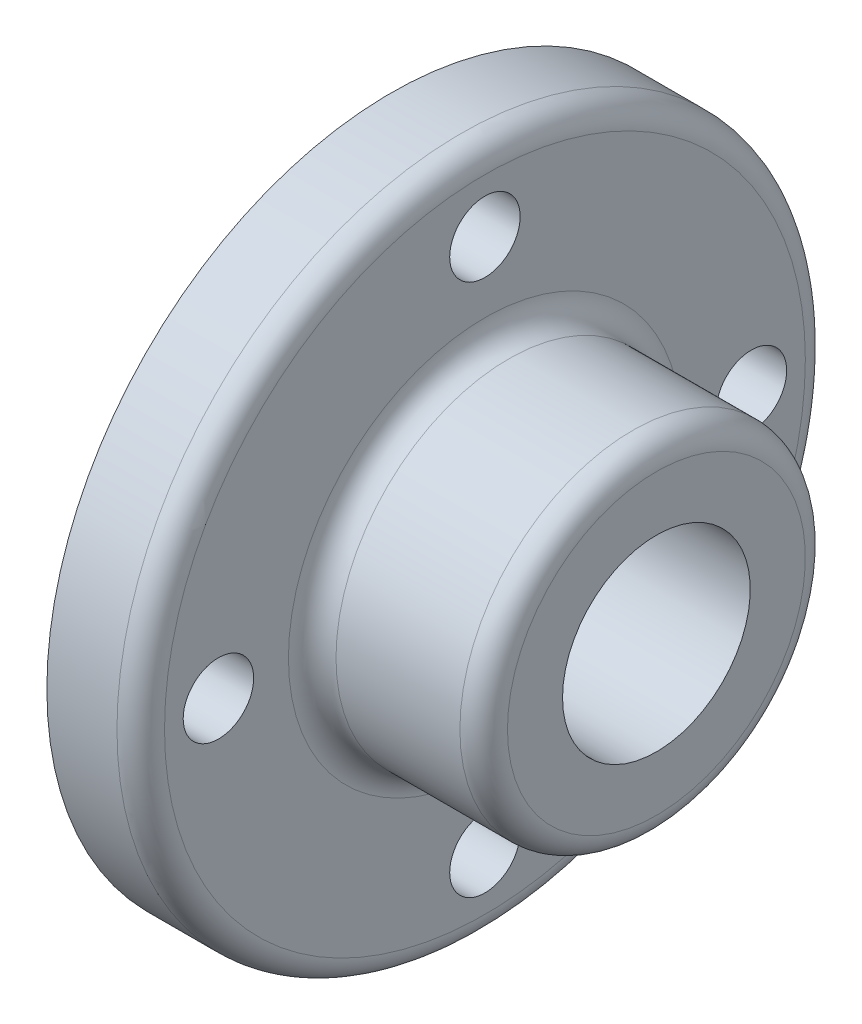
ISO-10303-21;
HEADER;
FILE_DESCRIPTION(('STEP AP214'),'2;1');
FILE_NAME('part.step','',(''),(''),'','','');
FILE_SCHEMA(('AUTOMOTIVE_DESIGN { 1 0 10303 214 1 1 1 1 }'));
ENDSEC;
DATA;
#1=APPLICATION_CONTEXT('core data for automotive mechanical design processes');
#2=APPLICATION_PROTOCOL_DEFINITION('international standard','automotive_design',2000,#1);
#3=PRODUCT_CONTEXT('',#1,'mechanical');
#4=PRODUCT('Part','Part','',(#3));
#5=PRODUCT_RELATED_PRODUCT_CATEGORY('part','',(#4));
#6=PRODUCT_DEFINITION_FORMATION('','',#4);
#7=PRODUCT_DEFINITION_CONTEXT('part definition',#1,'design');
#8=PRODUCT_DEFINITION('design','',#6,#7);
#9=PRODUCT_DEFINITION_SHAPE('','',#8);
#10=(LENGTH_UNIT() NAMED_UNIT(*) SI_UNIT(.MILLI.,.METRE.));
#11=(NAMED_UNIT(*) PLANE_ANGLE_UNIT() SI_UNIT($,.RADIAN.));
#12=(NAMED_UNIT(*) SI_UNIT($,.STERADIAN.) SOLID_ANGLE_UNIT());
#13=UNCERTAINTY_MEASURE_WITH_UNIT(LENGTH_MEASURE(1.E-05),#10,'distance_accuracy_value','');
#14=(GEOMETRIC_REPRESENTATION_CONTEXT(3) GLOBAL_UNCERTAINTY_ASSIGNED_CONTEXT((#13)) GLOBAL_UNIT_ASSIGNED_CONTEXT((#10,
#11,#12)) REPRESENTATION_CONTEXT('',''));
#15=CARTESIAN_POINT('',(0.,0.,0.));
#16=DIRECTION('',(0.,0.,1.));
#17=DIRECTION('',(1.,0.,0.));
#18=AXIS2_PLACEMENT_3D('',#15,#16,#17);
#19=CARTESIAN_POINT('',(-36.322,69.85,0.));
#20=DIRECTION('',(-1.,0.,0.));
#21=DIRECTION('',(0.,0.,1.));
#22=AXIS2_PLACEMENT_3D('',#19,#20,#21);
#23=PLANE('',#22);
#24=CARTESIAN_POINT('',(-36.322,0.,0.));
#25=DIRECTION('',(-1.,0.,0.));
#26=DIRECTION('',(0.,0.,1.));
#27=AXIS2_PLACEMENT_3D('',#24,#25,#26);
#28=CIRCLE('',#27,65.024);
#29=CARTESIAN_POINT('',(-36.322,0.,65.024));
#30=VERTEX_POINT('',#29);
#31=EDGE_CURVE('E60',#30,#30,#28,.F.);
#32=ORIENTED_EDGE('',*,*,#31,.T.);
#33=EDGE_LOOP('',(#32));
#34=FACE_BOUND('',#33,.T.);
#35=CARTESIAN_POINT('',(-36.322,0.,0.));
#36=DIRECTION('',(-1.,0.,0.));
#37=DIRECTION('',(0.,0.,1.));
#38=AXIS2_PLACEMENT_3D('',#35,#36,#37);
#39=CIRCLE('',#38,39.878);
#40=CARTESIAN_POINT('',(-36.322,0.,39.878));
#41=VERTEX_POINT('',#40);
#42=EDGE_CURVE('E65',#41,#41,#39,.T.);
#43=ORIENTED_EDGE('',*,*,#42,.T.);
#44=EDGE_LOOP('',(#43));
#45=FACE_BOUND('',#44,.T.);
#46=CARTESIAN_POINT('',(-36.322,-1.88828673336201E-13,-54.0826815356164));
#47=DIRECTION('',(-1.,0.,0.));
#48=DIRECTION('',(0.,0.,1.));
#49=AXIS2_PLACEMENT_3D('',#46,#47,#48);
#50=CIRCLE('',#49,7.1501);
#51=CARTESIAN_POINT('',(-36.322,-1.88828673336201E-13,-46.9325815356164));
#52=VERTEX_POINT('',#51);
#53=EDGE_CURVE('E86',#52,#52,#50,.T.);
#54=ORIENTED_EDGE('',*,*,#53,.T.);
#55=EDGE_LOOP('',(#54));
#56=FACE_BOUND('',#55,.T.);
#57=CARTESIAN_POINT('',(-36.322,-54.0826815356164,0.));
#58=DIRECTION('',(-1.,0.,0.));
#59=DIRECTION('',(0.,0.,1.));
#60=AXIS2_PLACEMENT_3D('',#57,#58,#59);
#61=CIRCLE('',#60,7.1501);
#62=CARTESIAN_POINT('',(-36.322,-54.0826815356164,7.1501));
#63=VERTEX_POINT('',#62);
#64=EDGE_CURVE('E89',#63,#63,#61,.T.);
#65=ORIENTED_EDGE('',*,*,#64,.T.);
#66=EDGE_LOOP('',(#65));
#67=FACE_BOUND('',#66,.T.);
#68=CARTESIAN_POINT('',(-36.322,5.66486020008603E-13,54.0826815356164));
#69=DIRECTION('',(-1.,0.,0.));
#70=DIRECTION('',(0.,0.,1.));
#71=AXIS2_PLACEMENT_3D('',#68,#69,#70);
#72=CIRCLE('',#71,7.1501);
#73=CARTESIAN_POINT('',(-36.322,5.66486020008603E-13,61.2327815356164));
#74=VERTEX_POINT('',#73);
#75=EDGE_CURVE('E92',#74,#74,#72,.T.);
#76=ORIENTED_EDGE('',*,*,#75,.T.);
#77=EDGE_LOOP('',(#76));
#78=FACE_BOUND('',#77,.T.);
#79=CARTESIAN_POINT('',(-36.322,54.0826815356164,0.));
#80=DIRECTION('',(-1.,0.,0.));
#81=DIRECTION('',(0.,0.,1.));
#82=AXIS2_PLACEMENT_3D('',#79,#80,#81);
#83=CIRCLE('',#82,7.1501);
#84=CARTESIAN_POINT('',(-36.322,54.0826815356164,7.1501));
#85=VERTEX_POINT('',#84);
#86=EDGE_CURVE('E78',#85,#85,#83,.T.);
#87=ORIENTED_EDGE('',*,*,#86,.T.);
#88=EDGE_LOOP('',(#87));
#89=FACE_BOUND('',#88,.T.);
#90=ADVANCED_FACE('F45',(#34,#45,#56,#67,#78,#89),#23,.F.);
#91=CARTESIAN_POINT('',(-88.7713924050633,0.,0.));
#92=DIRECTION('',(-1.,0.,0.));
#93=DIRECTION('',(0.,0.,1.));
#94=AXIS2_PLACEMENT_3D('',#91,#92,#93);
#95=CYLINDRICAL_SURFACE('',#94,69.85);
#96=CARTESIAN_POINT('',(-41.148,0.,0.));
#97=DIRECTION('',(-1.,0.,0.));
#98=DIRECTION('',(0.,0.,1.));
#99=AXIS2_PLACEMENT_3D('',#96,#97,#98);
#100=CIRCLE('',#99,69.85);
#101=CARTESIAN_POINT('',(-41.148,0.,69.85));
#102=VERTEX_POINT('',#101);
#103=EDGE_CURVE('E68',#102,#102,#100,.T.);
#104=ORIENTED_EDGE('',*,*,#103,.T.);
#105=EDGE_LOOP('',(#104));
#106=FACE_BOUND('',#105,.T.);
#107=CARTESIAN_POINT('',(-55.372,0.,0.));
#108=DIRECTION('',(-1.,0.,0.));
#109=DIRECTION('',(0.,0.,1.));
#110=AXIS2_PLACEMENT_3D('',#107,#108,#109);
#111=CIRCLE('',#110,69.85);
#112=CARTESIAN_POINT('',(-55.372,0.,69.85));
#113=VERTEX_POINT('',#112);
#114=EDGE_CURVE('E71',#113,#113,#111,.T.);
#115=ORIENTED_EDGE('',*,*,#114,.F.);
#116=EDGE_LOOP('',(#115));
#117=FACE_BOUND('',#116,.T.);
#118=ADVANCED_FACE('F112',(#106,#117),#95,.T.);
#119=CARTESIAN_POINT('',(-55.372,0.,0.));
#120=DIRECTION('',(1.,0.,0.));
#121=DIRECTION('',(0.,0.,-1.));
#122=AXIS2_PLACEMENT_3D('',#119,#120,#121);
#123=PLANE('',#122);
#124=CARTESIAN_POINT('',(-55.372,-1.88828673336201E-13,-54.0826815356164));
#125=DIRECTION('',(-1.,0.,0.));
#126=DIRECTION('',(0.,1.,0.));
#127=AXIS2_PLACEMENT_3D('',#124,#125,#126);
#128=CIRCLE('',#127,7.1501);
#129=CARTESIAN_POINT('',(-55.372,7.15009999999981,-54.0826815356165));
#130=VERTEX_POINT('',#129);
#131=EDGE_CURVE('E95',#130,#130,#128,.T.);
#132=ORIENTED_EDGE('',*,*,#131,.F.);
#133=EDGE_LOOP('',(#132));
#134=FACE_BOUND('',#133,.T.);
#135=CARTESIAN_POINT('',(-55.372,-54.0826815356164,0.));
#136=DIRECTION('',(-1.,0.,0.));
#137=DIRECTION('',(0.,0.,-1.));
#138=AXIS2_PLACEMENT_3D('',#135,#136,#137);
#139=CIRCLE('',#138,7.1501);
#140=CARTESIAN_POINT('',(-55.372,-54.0826815356164,-7.1501));
#141=VERTEX_POINT('',#140);
#142=EDGE_CURVE('E99',#141,#141,#139,.T.);
#143=ORIENTED_EDGE('',*,*,#142,.F.);
#144=EDGE_LOOP('',(#143));
#145=FACE_BOUND('',#144,.T.);
#146=CARTESIAN_POINT('',(-55.372,5.66486020008603E-13,54.0826815356164));
#147=DIRECTION('',(-1.,0.,0.));
#148=DIRECTION('',(0.,-1.,0.));
#149=AXIS2_PLACEMENT_3D('',#146,#147,#148);
#150=CIRCLE('',#149,7.1501);
#151=CARTESIAN_POINT('',(-55.372,-7.15009999999943,54.0826815356165));
#152=VERTEX_POINT('',#151);
#153=EDGE_CURVE('E96',#152,#152,#150,.T.);
#154=ORIENTED_EDGE('',*,*,#153,.F.);
#155=EDGE_LOOP('',(#154));
#156=FACE_BOUND('',#155,.T.);
#157=CARTESIAN_POINT('',(-55.372,54.0826815356164,0.));
#158=DIRECTION('',(-1.,0.,0.));
#159=DIRECTION('',(0.,0.,1.));
#160=AXIS2_PLACEMENT_3D('',#157,#158,#159);
#161=CIRCLE('',#160,7.1501);
#162=CARTESIAN_POINT('',(-55.372,54.0826815356164,7.1501));
#163=VERTEX_POINT('',#162);
#164=EDGE_CURVE('E83',#163,#163,#161,.T.);
#165=ORIENTED_EDGE('',*,*,#164,.F.);
#166=EDGE_LOOP('',(#165));
#167=FACE_BOUND('',#166,.T.);
#168=CARTESIAN_POINT('',(-55.372,0.,0.));
#169=DIRECTION('',(-1.,0.,0.));
#170=DIRECTION('',(0.,0.,1.));
#171=AXIS2_PLACEMENT_3D('',#168,#169,#170);
#172=CIRCLE('',#171,19.05);
#173=CARTESIAN_POINT('',(-55.372,0.,19.05));
#174=VERTEX_POINT('',#173);
#175=EDGE_CURVE('E75',#174,#174,#172,.T.);
#176=ORIENTED_EDGE('',*,*,#175,.F.);
#177=EDGE_LOOP('',(#176));
#178=FACE_BOUND('',#177,.T.);
#179=ORIENTED_EDGE('',*,*,#114,.T.);
#180=EDGE_LOOP('',(#179));
#181=FACE_BOUND('',#180,.T.);
#182=ADVANCED_FACE('F108',(#134,#145,#156,#167,#178,#181),#123,.F.);
#183=CARTESIAN_POINT('',(-1.52400000000001,35.052,0.));
#184=DIRECTION('',(-1.,0.,0.));
#185=DIRECTION('',(0.,0.,1.));
#186=AXIS2_PLACEMENT_3D('',#183,#184,#185);
#187=PLANE('',#186);
#188=CARTESIAN_POINT('',(-1.52400000000001,0.,0.));
#189=DIRECTION('',(-1.,0.,0.));
#190=DIRECTION('',(0.,0.,1.));
#191=AXIS2_PLACEMENT_3D('',#188,#189,#190);
#192=CIRCLE('',#191,30.226);
#193=CARTESIAN_POINT('',(-1.52400000000001,0.,30.226));
#194=VERTEX_POINT('',#193);
#195=EDGE_CURVE('E12',#194,#194,#192,.F.);
#196=ORIENTED_EDGE('',*,*,#195,.T.);
#197=EDGE_LOOP('',(#196));
#198=FACE_BOUND('',#197,.T.);
#199=CARTESIAN_POINT('',(-1.52400000000001,0.,0.));
#200=DIRECTION('',(-1.,0.,0.));
#201=DIRECTION('',(0.,0.,1.));
#202=AXIS2_PLACEMENT_3D('',#199,#200,#201);
#203=CIRCLE('',#202,19.05);
#204=CARTESIAN_POINT('',(-1.52400000000001,0.,19.05));
#205=VERTEX_POINT('',#204);
#206=EDGE_CURVE('E74',#205,#205,#203,.T.);
#207=ORIENTED_EDGE('',*,*,#206,.T.);
#208=EDGE_LOOP('',(#207));
#209=FACE_BOUND('',#208,.T.);
#210=ADVANCED_FACE('F111',(#198,#209),#187,.F.);
#211=CARTESIAN_POINT('',(-88.7713924050633,0.,0.));
#212=DIRECTION('',(-1.,0.,0.));
#213=DIRECTION('',(0.,0.,1.));
#214=AXIS2_PLACEMENT_3D('',#211,#212,#213);
#215=CYLINDRICAL_SURFACE('',#214,35.052);
#216=CARTESIAN_POINT('',(-31.496,0.,0.));
#217=DIRECTION('',(-1.,0.,0.));
#218=DIRECTION('',(0.,0.,1.));
#219=AXIS2_PLACEMENT_3D('',#216,#217,#218);
#220=CIRCLE('',#219,35.052);
#221=CARTESIAN_POINT('',(-31.496,0.,35.052));
#222=VERTEX_POINT('',#221);
#223=EDGE_CURVE('E52',#222,#222,#220,.F.);
#224=ORIENTED_EDGE('',*,*,#223,.T.);
#225=EDGE_LOOP('',(#224));
#226=FACE_BOUND('',#225,.T.);
#227=CARTESIAN_POINT('',(-6.35000000000001,0.,0.));
#228=DIRECTION('',(-1.,0.,0.));
#229=DIRECTION('',(0.,0.,1.));
#230=AXIS2_PLACEMENT_3D('',#227,#228,#229);
#231=CIRCLE('',#230,35.052);
#232=CARTESIAN_POINT('',(-6.35000000000001,0.,35.052));
#233=VERTEX_POINT('',#232);
#234=EDGE_CURVE('E56',#233,#233,#231,.T.);
#235=ORIENTED_EDGE('',*,*,#234,.T.);
#236=EDGE_LOOP('',(#235));
#237=FACE_BOUND('',#236,.T.);
#238=ADVANCED_FACE('F169',(#226,#237),#215,.T.);
#239=CARTESIAN_POINT('',(-1.52400000000001,0.,0.));
#240=DIRECTION('',(-1.,0.,0.));
#241=DIRECTION('',(0.,0.,1.));
#242=AXIS2_PLACEMENT_3D('',#239,#240,#241);
#243=CYLINDRICAL_SURFACE('',#242,19.05);
#244=ORIENTED_EDGE('',*,*,#206,.F.);
#245=EDGE_LOOP('',(#244));
#246=FACE_BOUND('',#245,.T.);
#247=ORIENTED_EDGE('',*,*,#175,.T.);
#248=EDGE_LOOP('',(#247));
#249=FACE_BOUND('',#248,.T.);
#250=ADVANCED_FACE('F159',(#246,#249),#243,.F.);
#251=CARTESIAN_POINT('',(-1.52400000000001,54.0826815356164,0.));
#252=DIRECTION('',(-1.,0.,0.));
#253=DIRECTION('',(0.,0.,1.));
#254=AXIS2_PLACEMENT_3D('',#251,#252,#253);
#255=CYLINDRICAL_SURFACE('',#254,7.1501);
#256=ORIENTED_EDGE('',*,*,#164,.T.);
#257=EDGE_LOOP('',(#256));
#258=FACE_BOUND('',#257,.T.);
#259=ORIENTED_EDGE('',*,*,#86,.F.);
#260=EDGE_LOOP('',(#259));
#261=FACE_BOUND('',#260,.T.);
#262=ADVANCED_FACE('F156',(#258,#261),#255,.F.);
#263=CARTESIAN_POINT('',(-1.52400000000001,5.66486020008603E-13,54.0826815356164));
#264=DIRECTION('',(-1.,0.,0.));
#265=DIRECTION('',(0.,0.,1.));
#266=AXIS2_PLACEMENT_3D('',#263,#264,#265);
#267=CYLINDRICAL_SURFACE('',#266,7.1501);
#268=ORIENTED_EDGE('',*,*,#153,.T.);
#269=EDGE_LOOP('',(#268));
#270=FACE_BOUND('',#269,.T.);
#271=ORIENTED_EDGE('',*,*,#75,.F.);
#272=EDGE_LOOP('',(#271));
#273=FACE_BOUND('',#272,.T.);
#274=ADVANCED_FACE('F158',(#270,#273),#267,.F.);
#275=CARTESIAN_POINT('',(-1.52400000000001,-54.0826815356164,0.));
#276=DIRECTION('',(-1.,0.,0.));
#277=DIRECTION('',(0.,0.,1.));
#278=AXIS2_PLACEMENT_3D('',#275,#276,#277);
#279=CYLINDRICAL_SURFACE('',#278,7.1501);
#280=ORIENTED_EDGE('',*,*,#142,.T.);
#281=EDGE_LOOP('',(#280));
#282=FACE_BOUND('',#281,.T.);
#283=ORIENTED_EDGE('',*,*,#64,.F.);
#284=EDGE_LOOP('',(#283));
#285=FACE_BOUND('',#284,.T.);
#286=ADVANCED_FACE('F166',(#282,#285),#279,.F.);
#287=CARTESIAN_POINT('',(-1.52400000000001,-1.88828673336201E-13,-54.0826815356164));
#288=DIRECTION('',(-1.,0.,0.));
#289=DIRECTION('',(0.,0.,1.));
#290=AXIS2_PLACEMENT_3D('',#287,#288,#289);
#291=CYLINDRICAL_SURFACE('',#290,7.1501);
#292=ORIENTED_EDGE('',*,*,#131,.T.);
#293=EDGE_LOOP('',(#292));
#294=FACE_BOUND('',#293,.T.);
#295=ORIENTED_EDGE('',*,*,#53,.F.);
#296=EDGE_LOOP('',(#295));
#297=FACE_BOUND('',#296,.T.);
#298=ADVANCED_FACE('F105',(#294,#297),#291,.F.);
#299=CARTESIAN_POINT('',(-41.148,0.,0.));
#300=DIRECTION('',(-1.,0.,0.));
#301=DIRECTION('',(0.,0.,1.));
#302=AXIS2_PLACEMENT_3D('',#299,#300,#301);
#303=TOROIDAL_SURFACE('',#302,65.024,4.826);
#304=ORIENTED_EDGE('',*,*,#31,.F.);
#305=EDGE_LOOP('',(#304));
#306=FACE_BOUND('',#305,.T.);
#307=ORIENTED_EDGE('',*,*,#103,.F.);
#308=EDGE_LOOP('',(#307));
#309=FACE_BOUND('',#308,.T.);
#310=ADVANCED_FACE('F134',(#306,#309),#303,.T.);
#311=CARTESIAN_POINT('',(-31.496,0.,0.));
#312=DIRECTION('',(-1.,0.,0.));
#313=DIRECTION('',(0.,0.,1.));
#314=AXIS2_PLACEMENT_3D('',#311,#312,#313);
#315=TOROIDAL_SURFACE('',#314,39.878,4.826);
#316=ORIENTED_EDGE('',*,*,#223,.F.);
#317=EDGE_LOOP('',(#316));
#318=FACE_BOUND('',#317,.T.);
#319=ORIENTED_EDGE('',*,*,#42,.F.);
#320=EDGE_LOOP('',(#319));
#321=FACE_BOUND('',#320,.T.);
#322=ADVANCED_FACE('F136',(#318,#321),#315,.F.);
#323=CARTESIAN_POINT('',(-6.35000000000001,0.,0.));
#324=DIRECTION('',(-1.,0.,0.));
#325=DIRECTION('',(0.,0.,1.));
#326=AXIS2_PLACEMENT_3D('',#323,#324,#325);
#327=TOROIDAL_SURFACE('',#326,30.226,4.826);
#328=ORIENTED_EDGE('',*,*,#195,.F.);
#329=EDGE_LOOP('',(#328));
#330=FACE_BOUND('',#329,.T.);
#331=ORIENTED_EDGE('',*,*,#234,.F.);
#332=EDGE_LOOP('',(#331));
#333=FACE_BOUND('',#332,.T.);
#334=ADVANCED_FACE('F47',(#330,#333),#327,.T.);
#335=CLOSED_SHELL('',(#90,#118,#182,#210,#238,#250,#262,#274,#286,#298,#310,#322,#334));
#336=MANIFOLD_SOLID_BREP('B2',#335);
#337=ADVANCED_BREP_SHAPE_REPRESENTATION('',(#18,#336),#14);
#338=SHAPE_DEFINITION_REPRESENTATION(#9,#337);
ENDSEC;
END-ISO-10303-21;
